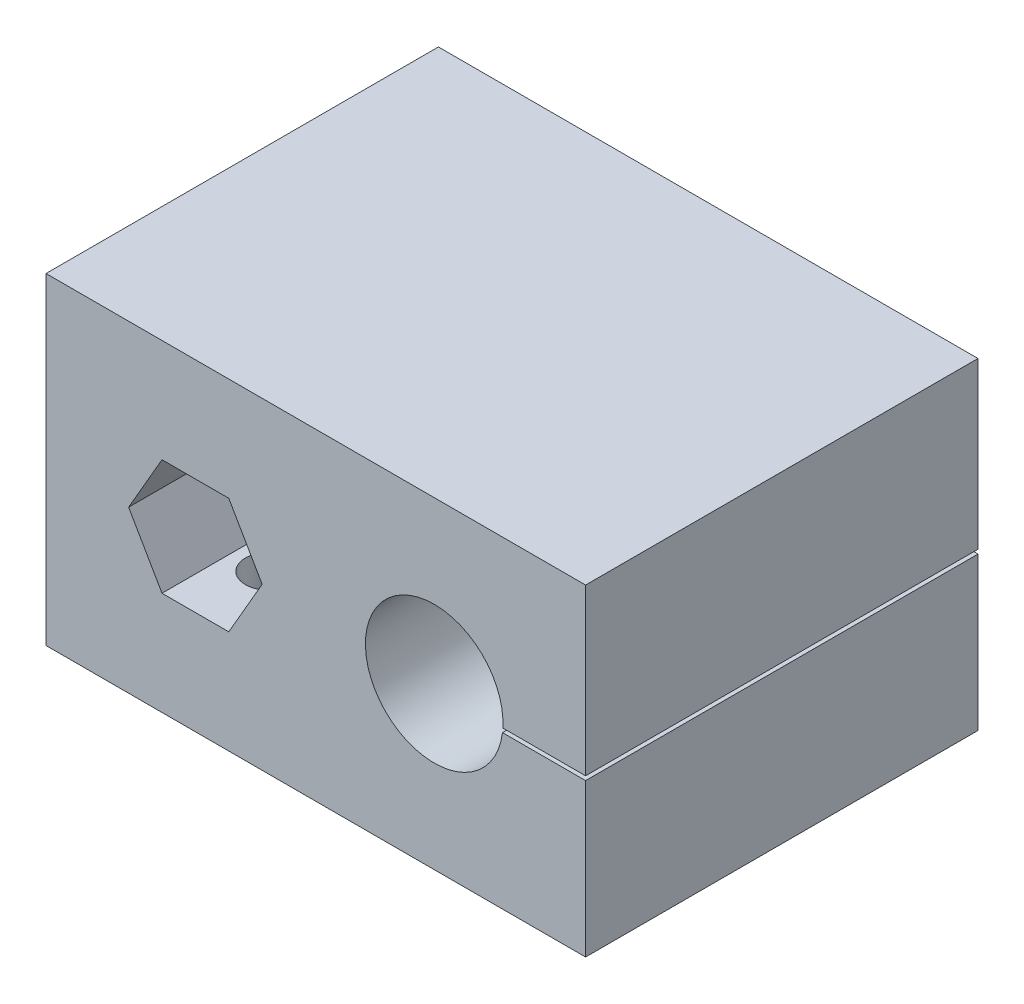
ISO-10303-21;
HEADER;
FILE_DESCRIPTION(('STEP AP214'),'2;1');
FILE_NAME('part.step','',(''),(''),'','','');
FILE_SCHEMA(('AUTOMOTIVE_DESIGN { 1 0 10303 214 1 1 1 1 }'));
ENDSEC;
DATA;
#1=APPLICATION_CONTEXT('core data for automotive mechanical design processes');
#2=APPLICATION_PROTOCOL_DEFINITION('international standard','automotive_design',2000,#1);
#3=PRODUCT_CONTEXT('',#1,'mechanical');
#4=PRODUCT('Part','Part','',(#3));
#5=PRODUCT_RELATED_PRODUCT_CATEGORY('part','',(#4));
#6=PRODUCT_DEFINITION_FORMATION('','',#4);
#7=PRODUCT_DEFINITION_CONTEXT('part definition',#1,'design');
#8=PRODUCT_DEFINITION('design','',#6,#7);
#9=PRODUCT_DEFINITION_SHAPE('','',#8);
#10=(LENGTH_UNIT() NAMED_UNIT(*) SI_UNIT(.MILLI.,.METRE.));
#11=(NAMED_UNIT(*) PLANE_ANGLE_UNIT() SI_UNIT($,.RADIAN.));
#12=(NAMED_UNIT(*) SI_UNIT($,.STERADIAN.) SOLID_ANGLE_UNIT());
#13=UNCERTAINTY_MEASURE_WITH_UNIT(LENGTH_MEASURE(1.E-05),#10,'distance_accuracy_value','');
#14=(GEOMETRIC_REPRESENTATION_CONTEXT(3) GLOBAL_UNCERTAINTY_ASSIGNED_CONTEXT((#13)) GLOBAL_UNIT_ASSIGNED_CONTEXT((#10,
#11,#12)) REPRESENTATION_CONTEXT('',''));
#15=CARTESIAN_POINT('',(0.,0.,0.));
#16=DIRECTION('',(0.,0.,1.));
#17=DIRECTION('',(1.,0.,0.));
#18=AXIS2_PLACEMENT_3D('',#15,#16,#17);
#19=CARTESIAN_POINT('',(16.7132,9.906254,12.065));
#20=DIRECTION('',(-1.,0.,0.));
#21=DIRECTION('',(0.,-1.,0.));
#22=AXIS2_PLACEMENT_3D('',#19,#20,#21);
#23=PLANE('',#22);
#24=DIRECTION('',(0.,1.,0.));
#25=VECTOR('',#24,1.);
#26=CARTESIAN_POINT('',(16.7132,9.906254,-12.065));
#27=LINE('',#26,#25);
#28=CARTESIAN_POINT('',(16.7132,-9.905746,-12.065));
#29=VERTEX_POINT('',#28);
#30=CARTESIAN_POINT('',(16.7132,-0.508,-12.065));
#31=VERTEX_POINT('',#30);
#32=EDGE_CURVE('E173',#29,#31,#27,.T.);
#33=ORIENTED_EDGE('',*,*,#32,.T.);
#34=DIRECTION('',(0.,0.,1.));
#35=VECTOR('',#34,1.);
#36=CARTESIAN_POINT('',(16.7132,-0.507999999999998,12.065));
#37=LINE('',#36,#35);
#38=CARTESIAN_POINT('',(16.7132,-0.508,12.065));
#39=VERTEX_POINT('',#38);
#40=EDGE_CURVE('E138',#31,#39,#37,.T.);
#41=ORIENTED_EDGE('',*,*,#40,.T.);
#42=DIRECTION('',(0.,1.,0.));
#43=VECTOR('',#42,1.);
#44=CARTESIAN_POINT('',(16.7132,9.906254,12.065));
#45=LINE('',#44,#43);
#46=CARTESIAN_POINT('',(16.7132,-9.905746,12.065));
#47=VERTEX_POINT('',#46);
#48=EDGE_CURVE('E155',#47,#39,#45,.T.);
#49=ORIENTED_EDGE('',*,*,#48,.F.);
#50=DIRECTION('',(0.,0.,-1.));
#51=VECTOR('',#50,1.);
#52=CARTESIAN_POINT('',(16.7132,-9.905746,12.065));
#53=LINE('',#52,#51);
#54=EDGE_CURVE('E181',#47,#29,#53,.T.);
#55=ORIENTED_EDGE('',*,*,#54,.T.);
#56=EDGE_LOOP('',(#33,#41,#49,#55));
#57=FACE_BOUND('',#56,.T.);
#58=ADVANCED_FACE('F33',(#57),#23,.F.);
#59=CARTESIAN_POINT('',(0.,0.,12.065));
#60=DIRECTION('',(0.,0.,1.));
#61=DIRECTION('',(1.,0.,0.));
#62=AXIS2_PLACEMENT_3D('',#59,#60,#61);
#63=PLANE('',#62);
#64=DIRECTION('',(1.,0.,0.));
#65=VECTOR('',#64,1.);
#66=CARTESIAN_POINT('',(7.51896494974591,-0.508,12.065));
#67=LINE('',#66,#65);
#68=CARTESIAN_POINT('',(11.6025478895759,-0.508,12.065));
#69=VERTEX_POINT('',#68);
#70=EDGE_CURVE('E149',#69,#39,#67,.T.);
#71=ORIENTED_EDGE('',*,*,#70,.F.);
#72=CARTESIAN_POINT('',(7.4041,0.000254,12.065));
#73=DIRECTION('',(0.,0.,1.));
#74=DIRECTION('',(1.,0.,0.));
#75=AXIS2_PLACEMENT_3D('',#72,#73,#74);
#76=CIRCLE('',#75,4.2291);
#77=CARTESIAN_POINT('',(11.6255501908093,-0.254,12.065));
#78=VERTEX_POINT('',#77);
#79=EDGE_CURVE('E148',#78,#69,#76,.T.);
#80=ORIENTED_EDGE('',*,*,#79,.F.);
#81=DIRECTION('',(-1.,0.,0.));
#82=VECTOR('',#81,1.);
#83=CARTESIAN_POINT('',(7.51896494974591,-0.254,12.065));
#84=LINE('',#83,#82);
#85=CARTESIAN_POINT('',(16.7132,-0.254,12.065));
#86=VERTEX_POINT('',#85);
#87=EDGE_CURVE('E55',#86,#78,#84,.T.);
#88=ORIENTED_EDGE('',*,*,#87,.F.);
#89=CARTESIAN_POINT('',(16.7132,9.906254,12.065));
#90=VERTEX_POINT('',#89);
#91=EDGE_CURVE('E145',#86,#90,#45,.T.);
#92=ORIENTED_EDGE('',*,*,#91,.T.);
#93=DIRECTION('',(-1.,0.,0.));
#94=VECTOR('',#93,1.);
#95=CARTESIAN_POINT('',(-16.4672302289532,9.906254,12.065));
#96=LINE('',#95,#94);
#97=CARTESIAN_POINT('',(-16.4672302289532,9.906254,12.065));
#98=VERTEX_POINT('',#97);
#99=EDGE_CURVE('E159',#90,#98,#96,.T.);
#100=ORIENTED_EDGE('',*,*,#99,.T.);
#101=DIRECTION('',(0.,-1.,0.));
#102=VECTOR('',#101,1.);
#103=CARTESIAN_POINT('',(-16.4672302289532,9.906254,12.065));
#104=LINE('',#103,#102);
#105=CARTESIAN_POINT('',(-16.4672302289532,-9.905746,12.065));
#106=VERTEX_POINT('',#105);
#107=EDGE_CURVE('E160',#98,#106,#104,.T.);
#108=ORIENTED_EDGE('',*,*,#107,.T.);
#109=DIRECTION('',(1.,0.,0.));
#110=VECTOR('',#109,1.);
#111=CARTESIAN_POINT('',(-16.4672302289532,-9.905746,12.065));
#112=LINE('',#111,#110);
#113=EDGE_CURVE('E156',#106,#47,#112,.T.);
#114=ORIENTED_EDGE('',*,*,#113,.T.);
#115=ORIENTED_EDGE('',*,*,#48,.T.);
#116=EDGE_LOOP('',(#71,#80,#88,#92,#100,#108,#114,#115));
#117=FACE_BOUND('',#116,.T.);
#118=DIRECTION('',(0.5,-0.866025403784439,0.));
#119=VECTOR('',#118,1.);
#120=CARTESIAN_POINT('',(-11.3872302289532,0.000254000000003339,12.065));
#121=LINE('',#120,#119);
#122=CARTESIAN_POINT('',(-11.3872302289532,0.000254000000003339,12.065));
#123=VERTEX_POINT('',#122);
#124=CARTESIAN_POINT('',(-9.33417267171493,-3.555746,12.065));
#125=VERTEX_POINT('',#124);
#126=EDGE_CURVE('E205',#123,#125,#121,.T.);
#127=ORIENTED_EDGE('',*,*,#126,.F.);
#128=DIRECTION('',(-0.5,-0.866025403784439,0.));
#129=VECTOR('',#128,1.);
#130=CARTESIAN_POINT('',(-9.33417267171493,3.556254,12.065));
#131=LINE('',#130,#129);
#132=CARTESIAN_POINT('',(-9.33417267171493,3.556254,12.065));
#133=VERTEX_POINT('',#132);
#134=EDGE_CURVE('E203',#133,#123,#131,.T.);
#135=ORIENTED_EDGE('',*,*,#134,.F.);
#136=DIRECTION('',(-1.,0.,0.));
#137=VECTOR('',#136,1.);
#138=CARTESIAN_POINT('',(-5.22805755723831,3.556254,12.065));
#139=LINE('',#138,#137);
#140=CARTESIAN_POINT('',(-5.22805755723831,3.556254,12.065));
#141=VERTEX_POINT('',#140);
#142=EDGE_CURVE('E215',#141,#133,#139,.T.);
#143=ORIENTED_EDGE('',*,*,#142,.F.);
#144=DIRECTION('',(-0.5,0.866025403784439,0.));
#145=VECTOR('',#144,1.);
#146=CARTESIAN_POINT('',(-3.175,0.000254000000000001,12.065));
#147=LINE('',#146,#145);
#148=CARTESIAN_POINT('',(-3.175,0.000254000000000001,12.065));
#149=VERTEX_POINT('',#148);
#150=EDGE_CURVE('E212',#149,#141,#147,.T.);
#151=ORIENTED_EDGE('',*,*,#150,.F.);
#152=DIRECTION('',(0.5,0.866025403784439,0.));
#153=VECTOR('',#152,1.);
#154=CARTESIAN_POINT('',(-5.22805755723831,-3.555746,12.065));
#155=LINE('',#154,#153);
#156=CARTESIAN_POINT('',(-5.22805755723831,-3.555746,12.065));
#157=VERTEX_POINT('',#156);
#158=EDGE_CURVE('E210',#157,#149,#155,.T.);
#159=ORIENTED_EDGE('',*,*,#158,.F.);
#160=DIRECTION('',(1.,0.,0.));
#161=VECTOR('',#160,1.);
#162=CARTESIAN_POINT('',(-9.33417267171493,-3.555746,12.065));
#163=LINE('',#162,#161);
#164=EDGE_CURVE('E208',#125,#157,#163,.T.);
#165=ORIENTED_EDGE('',*,*,#164,.F.);
#166=EDGE_LOOP('',(#127,#135,#143,#151,#159,#165));
#167=FACE_BOUND('',#166,.T.);
#168=ADVANCED_FACE('F143',(#117,#167),#63,.T.);
#169=CARTESIAN_POINT('',(0.,0.,-12.065));
#170=DIRECTION('',(0.,0.,1.));
#171=DIRECTION('',(1.,0.,0.));
#172=AXIS2_PLACEMENT_3D('',#169,#170,#171);
#173=PLANE('',#172);
#174=DIRECTION('',(-0.5,-0.866025403784439,0.));
#175=VECTOR('',#174,1.);
#176=CARTESIAN_POINT('',(-9.33417267171493,3.556254,-12.065));
#177=LINE('',#176,#175);
#178=CARTESIAN_POINT('',(-9.33417267171493,3.556254,-12.065));
#179=VERTEX_POINT('',#178);
#180=CARTESIAN_POINT('',(-11.3872302289532,0.000254000000003339,-12.065));
#181=VERTEX_POINT('',#180);
#182=EDGE_CURVE('E197',#179,#181,#177,.T.);
#183=ORIENTED_EDGE('',*,*,#182,.T.);
#184=DIRECTION('',(0.5,-0.866025403784439,0.));
#185=VECTOR('',#184,1.);
#186=CARTESIAN_POINT('',(-11.3872302289532,0.000254000000003339,-12.065));
#187=LINE('',#186,#185);
#188=CARTESIAN_POINT('',(-9.33417267171493,-3.555746,-12.065));
#189=VERTEX_POINT('',#188);
#190=EDGE_CURVE('E220',#181,#189,#187,.T.);
#191=ORIENTED_EDGE('',*,*,#190,.T.);
#192=DIRECTION('',(1.,0.,0.));
#193=VECTOR('',#192,1.);
#194=CARTESIAN_POINT('',(-9.33417267171493,-3.555746,-12.065));
#195=LINE('',#194,#193);
#196=CARTESIAN_POINT('',(-5.22805755723831,-3.555746,-12.065));
#197=VERTEX_POINT('',#196);
#198=EDGE_CURVE('E223',#189,#197,#195,.T.);
#199=ORIENTED_EDGE('',*,*,#198,.T.);
#200=DIRECTION('',(0.5,0.866025403784439,0.));
#201=VECTOR('',#200,1.);
#202=CARTESIAN_POINT('',(-5.22805755723831,-3.555746,-12.065));
#203=LINE('',#202,#201);
#204=CARTESIAN_POINT('',(-3.175,0.000254000000000001,-12.065));
#205=VERTEX_POINT('',#204);
#206=EDGE_CURVE('E226',#197,#205,#203,.T.);
#207=ORIENTED_EDGE('',*,*,#206,.T.);
#208=DIRECTION('',(-0.5,0.866025403784439,0.));
#209=VECTOR('',#208,1.);
#210=CARTESIAN_POINT('',(-3.175,0.000254000000000001,-12.065));
#211=LINE('',#210,#209);
#212=CARTESIAN_POINT('',(-5.22805755723831,3.556254,-12.065));
#213=VERTEX_POINT('',#212);
#214=EDGE_CURVE('E229',#205,#213,#211,.T.);
#215=ORIENTED_EDGE('',*,*,#214,.T.);
#216=DIRECTION('',(-1.,0.,0.));
#217=VECTOR('',#216,1.);
#218=CARTESIAN_POINT('',(-5.22805755723831,3.556254,-12.065));
#219=LINE('',#218,#217);
#220=EDGE_CURVE('E206',#213,#179,#219,.T.);
#221=ORIENTED_EDGE('',*,*,#220,.T.);
#222=EDGE_LOOP('',(#183,#191,#199,#207,#215,#221));
#223=FACE_BOUND('',#222,.T.);
#224=CARTESIAN_POINT('',(7.4041,0.000254,-12.065));
#225=DIRECTION('',(0.,0.,1.));
#226=DIRECTION('',(1.,0.,0.));
#227=AXIS2_PLACEMENT_3D('',#224,#225,#226);
#228=CIRCLE('',#227,4.2291);
#229=CARTESIAN_POINT('',(11.6255501908093,-0.254,-12.065));
#230=VERTEX_POINT('',#229);
#231=CARTESIAN_POINT('',(11.6025478895759,-0.508,-12.065));
#232=VERTEX_POINT('',#231);
#233=EDGE_CURVE('E191',#230,#232,#228,.T.);
#234=ORIENTED_EDGE('',*,*,#233,.T.);
#235=DIRECTION('',(1.,0.,0.));
#236=VECTOR('',#235,1.);
#237=CARTESIAN_POINT('',(7.51896494974591,-0.508,-12.065));
#238=LINE('',#237,#236);
#239=EDGE_CURVE('E47',#232,#31,#238,.T.);
#240=ORIENTED_EDGE('',*,*,#239,.T.);
#241=ORIENTED_EDGE('',*,*,#32,.F.);
#242=DIRECTION('',(1.,0.,0.));
#243=VECTOR('',#242,1.);
#244=CARTESIAN_POINT('',(-16.4672302289532,-9.905746,-12.065));
#245=LINE('',#244,#243);
#246=CARTESIAN_POINT('',(-16.4672302289532,-9.905746,-12.065));
#247=VERTEX_POINT('',#246);
#248=EDGE_CURVE('E169',#247,#29,#245,.T.);
#249=ORIENTED_EDGE('',*,*,#248,.F.);
#250=DIRECTION('',(0.,-1.,0.));
#251=VECTOR('',#250,1.);
#252=CARTESIAN_POINT('',(-16.4672302289532,9.906254,-12.065));
#253=LINE('',#252,#251);
#254=CARTESIAN_POINT('',(-16.4672302289532,9.906254,-12.065));
#255=VERTEX_POINT('',#254);
#256=EDGE_CURVE('E166',#255,#247,#253,.T.);
#257=ORIENTED_EDGE('',*,*,#256,.F.);
#258=DIRECTION('',(-1.,0.,0.));
#259=VECTOR('',#258,1.);
#260=CARTESIAN_POINT('',(-16.4672302289532,9.906254,-12.065));
#261=LINE('',#260,#259);
#262=CARTESIAN_POINT('',(16.7132,9.906254,-12.065));
#263=VERTEX_POINT('',#262);
#264=EDGE_CURVE('E176',#263,#255,#261,.T.);
#265=ORIENTED_EDGE('',*,*,#264,.F.);
#266=CARTESIAN_POINT('',(16.7132,-0.254,-12.065));
#267=VERTEX_POINT('',#266);
#268=EDGE_CURVE('E172',#267,#263,#27,.T.);
#269=ORIENTED_EDGE('',*,*,#268,.F.);
#270=DIRECTION('',(-1.,0.,0.));
#271=VECTOR('',#270,1.);
#272=CARTESIAN_POINT('',(7.51896494974591,-0.254,-12.065));
#273=LINE('',#272,#271);
#274=EDGE_CURVE('E134',#267,#230,#273,.T.);
#275=ORIENTED_EDGE('',*,*,#274,.T.);
#276=EDGE_LOOP('',(#234,#240,#241,#249,#257,#265,#269,#275));
#277=FACE_BOUND('',#276,.T.);
#278=ADVANCED_FACE('F190',(#223,#277),#173,.F.);
#279=CARTESIAN_POINT('',(-16.4672302289532,9.906254,12.065));
#280=DIRECTION('',(1.,0.,0.));
#281=DIRECTION('',(0.,1.,0.));
#282=AXIS2_PLACEMENT_3D('',#279,#280,#281);
#283=PLANE('',#282);
#284=ORIENTED_EDGE('',*,*,#256,.T.);
#285=DIRECTION('',(0.,0.,-1.));
#286=VECTOR('',#285,1.);
#287=CARTESIAN_POINT('',(-16.4672302289532,-9.905746,12.065));
#288=LINE('',#287,#286);
#289=EDGE_CURVE('E184',#106,#247,#288,.T.);
#290=ORIENTED_EDGE('',*,*,#289,.F.);
#291=ORIENTED_EDGE('',*,*,#107,.F.);
#292=DIRECTION('',(0.,0.,-1.));
#293=VECTOR('',#292,1.);
#294=CARTESIAN_POINT('',(-16.4672302289532,9.906254,12.065));
#295=LINE('',#294,#293);
#296=EDGE_CURVE('E165',#98,#255,#295,.T.);
#297=ORIENTED_EDGE('',*,*,#296,.T.);
#298=EDGE_LOOP('',(#284,#290,#291,#297));
#299=FACE_BOUND('',#298,.T.);
#300=ADVANCED_FACE('F35',(#299),#283,.F.);
#301=CARTESIAN_POINT('',(-16.4672302289532,-9.905746,12.065));
#302=DIRECTION('',(0.,1.,0.));
#303=DIRECTION('',(0.,0.,1.));
#304=AXIS2_PLACEMENT_3D('',#301,#302,#303);
#305=PLANE('',#304);
#306=CARTESIAN_POINT('',(-7.22812578387597,-9.905746,7.62));
#307=DIRECTION('',(0.,1.,0.));
#308=DIRECTION('',(0.,0.,1.));
#309=AXIS2_PLACEMENT_3D('',#306,#307,#308);
#310=CIRCLE('',#309,1.4224);
#311=CARTESIAN_POINT('',(-7.22812578387597,-9.905746,9.0424));
#312=VERTEX_POINT('',#311);
#313=EDGE_CURVE('E262',#312,#312,#310,.F.);
#314=ORIENTED_EDGE('',*,*,#313,.F.);
#315=EDGE_LOOP('',(#314));
#316=FACE_BOUND('',#315,.T.);
#317=CARTESIAN_POINT('',(-7.22812578387597,-9.905746,-7.62));
#318=DIRECTION('',(0.,1.,0.));
#319=DIRECTION('',(0.,0.,1.));
#320=AXIS2_PLACEMENT_3D('',#317,#318,#319);
#321=CIRCLE('',#320,1.4224);
#322=CARTESIAN_POINT('',(-7.22812578387597,-9.905746,-6.1976));
#323=VERTEX_POINT('',#322);
#324=EDGE_CURVE('E195',#323,#323,#321,.F.);
#325=ORIENTED_EDGE('',*,*,#324,.F.);
#326=EDGE_LOOP('',(#325));
#327=FACE_BOUND('',#326,.T.);
#328=ORIENTED_EDGE('',*,*,#248,.T.);
#329=ORIENTED_EDGE('',*,*,#54,.F.);
#330=ORIENTED_EDGE('',*,*,#113,.F.);
#331=ORIENTED_EDGE('',*,*,#289,.T.);
#332=EDGE_LOOP('',(#328,#329,#330,#331));
#333=FACE_BOUND('',#332,.T.);
#334=ADVANCED_FACE('F253',(#316,#327,#333),#305,.F.);
#335=ORIENTED_EDGE('',*,*,#91,.F.);
#336=DIRECTION('',(0.,0.,-1.));
#337=VECTOR('',#336,1.);
#338=CARTESIAN_POINT('',(16.7132,-0.253999999999999,12.065));
#339=LINE('',#338,#337);
#340=EDGE_CURVE('E131',#86,#267,#339,.T.);
#341=ORIENTED_EDGE('',*,*,#340,.T.);
#342=ORIENTED_EDGE('',*,*,#268,.T.);
#343=DIRECTION('',(0.,0.,-1.));
#344=VECTOR('',#343,1.);
#345=CARTESIAN_POINT('',(16.7132,9.906254,12.065));
#346=LINE('',#345,#344);
#347=EDGE_CURVE('E153',#90,#263,#346,.T.);
#348=ORIENTED_EDGE('',*,*,#347,.F.);
#349=EDGE_LOOP('',(#335,#341,#342,#348));
#350=FACE_BOUND('',#349,.T.);
#351=ADVANCED_FACE('F151',(#350),#23,.F.);
#352=CARTESIAN_POINT('',(-16.4672302289532,9.906254,12.065));
#353=DIRECTION('',(0.,-1.,0.));
#354=DIRECTION('',(0.,0.,-1.));
#355=AXIS2_PLACEMENT_3D('',#352,#353,#354);
#356=PLANE('',#355);
#357=ORIENTED_EDGE('',*,*,#264,.T.);
#358=ORIENTED_EDGE('',*,*,#296,.F.);
#359=ORIENTED_EDGE('',*,*,#99,.F.);
#360=ORIENTED_EDGE('',*,*,#347,.T.);
#361=EDGE_LOOP('',(#357,#358,#359,#360));
#362=FACE_BOUND('',#361,.T.);
#363=ADVANCED_FACE('F287',(#362),#356,.F.);
#364=CARTESIAN_POINT('',(-9.33417267171493,3.556254,12.065));
#365=DIRECTION('',(0.866025403784438,-0.5,0.));
#366=DIRECTION('',(0.5,0.866025403784439,0.));
#367=AXIS2_PLACEMENT_3D('',#364,#365,#366);
#368=PLANE('',#367);
#369=ORIENTED_EDGE('',*,*,#182,.F.);
#370=DIRECTION('',(0.,0.,-1.));
#371=VECTOR('',#370,1.);
#372=CARTESIAN_POINT('',(-9.33417267171493,3.556254,12.065));
#373=LINE('',#372,#371);
#374=EDGE_CURVE('E217',#133,#179,#373,.T.);
#375=ORIENTED_EDGE('',*,*,#374,.F.);
#376=ORIENTED_EDGE('',*,*,#134,.T.);
#377=DIRECTION('',(0.,0.,-1.));
#378=VECTOR('',#377,1.);
#379=CARTESIAN_POINT('',(-11.3872302289532,0.000254000000003339,12.065));
#380=LINE('',#379,#378);
#381=EDGE_CURVE('E170',#123,#181,#380,.T.);
#382=ORIENTED_EDGE('',*,*,#381,.T.);
#383=EDGE_LOOP('',(#369,#375,#376,#382));
#384=FACE_BOUND('',#383,.T.);
#385=ADVANCED_FACE('F298',(#384),#368,.T.);
#386=CARTESIAN_POINT('',(-11.3872302289532,0.000254000000003339,12.065));
#387=DIRECTION('',(0.866025403784439,0.5,0.));
#388=DIRECTION('',(-0.5,0.866025403784439,0.));
#389=AXIS2_PLACEMENT_3D('',#386,#387,#388);
#390=PLANE('',#389);
#391=ORIENTED_EDGE('',*,*,#190,.F.);
#392=ORIENTED_EDGE('',*,*,#381,.F.);
#393=ORIENTED_EDGE('',*,*,#126,.T.);
#394=DIRECTION('',(0.,0.,-1.));
#395=VECTOR('',#394,1.);
#396=CARTESIAN_POINT('',(-9.33417267171493,-3.555746,12.065));
#397=LINE('',#396,#395);
#398=EDGE_CURVE('E242',#125,#189,#397,.T.);
#399=ORIENTED_EDGE('',*,*,#398,.T.);
#400=EDGE_LOOP('',(#391,#392,#393,#399));
#401=FACE_BOUND('',#400,.T.);
#402=ADVANCED_FACE('F305',(#401),#390,.T.);
#403=CARTESIAN_POINT('',(-9.33417267171493,-3.555746,12.065));
#404=DIRECTION('',(0.,1.,0.));
#405=DIRECTION('',(0.,0.,1.));
#406=AXIS2_PLACEMENT_3D('',#403,#404,#405);
#407=PLANE('',#406);
#408=CARTESIAN_POINT('',(-7.22812578387597,-3.555746,7.62));
#409=DIRECTION('',(0.,1.,0.));
#410=DIRECTION('',(0.,0.,1.));
#411=AXIS2_PLACEMENT_3D('',#408,#409,#410);
#412=CIRCLE('',#411,1.4224);
#413=CARTESIAN_POINT('',(-7.22812578387597,-3.555746,9.0424));
#414=VERTEX_POINT('',#413);
#415=EDGE_CURVE('E265',#414,#414,#412,.F.);
#416=ORIENTED_EDGE('',*,*,#415,.T.);
#417=EDGE_LOOP('',(#416));
#418=FACE_BOUND('',#417,.T.);
#419=CARTESIAN_POINT('',(-7.22812578387597,-3.555746,-7.62));
#420=DIRECTION('',(0.,1.,0.));
#421=DIRECTION('',(0.,0.,1.));
#422=AXIS2_PLACEMENT_3D('',#419,#420,#421);
#423=CIRCLE('',#422,1.4224);
#424=CARTESIAN_POINT('',(-7.22812578387597,-3.555746,-6.1976));
#425=VERTEX_POINT('',#424);
#426=EDGE_CURVE('E200',#425,#425,#423,.F.);
#427=ORIENTED_EDGE('',*,*,#426,.T.);
#428=EDGE_LOOP('',(#427));
#429=FACE_BOUND('',#428,.T.);
#430=ORIENTED_EDGE('',*,*,#198,.F.);
#431=ORIENTED_EDGE('',*,*,#398,.F.);
#432=ORIENTED_EDGE('',*,*,#164,.T.);
#433=DIRECTION('',(0.,0.,-1.));
#434=VECTOR('',#433,1.);
#435=CARTESIAN_POINT('',(-5.22805755723831,-3.555746,12.065));
#436=LINE('',#435,#434);
#437=EDGE_CURVE('E240',#157,#197,#436,.T.);
#438=ORIENTED_EDGE('',*,*,#437,.T.);
#439=EDGE_LOOP('',(#430,#431,#432,#438));
#440=FACE_BOUND('',#439,.T.);
#441=ADVANCED_FACE('F271',(#418,#429,#440),#407,.T.);
#442=CARTESIAN_POINT('',(-5.22805755723831,-3.555746,12.065));
#443=DIRECTION('',(-0.866025403784438,0.5,0.));
#444=DIRECTION('',(-0.5,-0.866025403784439,0.));
#445=AXIS2_PLACEMENT_3D('',#442,#443,#444);
#446=PLANE('',#445);
#447=ORIENTED_EDGE('',*,*,#206,.F.);
#448=ORIENTED_EDGE('',*,*,#437,.F.);
#449=ORIENTED_EDGE('',*,*,#158,.T.);
#450=DIRECTION('',(0.,0.,-1.));
#451=VECTOR('',#450,1.);
#452=CARTESIAN_POINT('',(-3.175,0.000254000000000001,12.065));
#453=LINE('',#452,#451);
#454=EDGE_CURVE('E238',#149,#205,#453,.T.);
#455=ORIENTED_EDGE('',*,*,#454,.T.);
#456=EDGE_LOOP('',(#447,#448,#449,#455));
#457=FACE_BOUND('',#456,.T.);
#458=ADVANCED_FACE('F312',(#457),#446,.T.);
#459=CARTESIAN_POINT('',(-3.175,0.000254000000000001,12.065));
#460=DIRECTION('',(-0.866025403784439,-0.5,0.));
#461=DIRECTION('',(0.5,-0.866025403784439,0.));
#462=AXIS2_PLACEMENT_3D('',#459,#460,#461);
#463=PLANE('',#462);
#464=ORIENTED_EDGE('',*,*,#214,.F.);
#465=ORIENTED_EDGE('',*,*,#454,.F.);
#466=ORIENTED_EDGE('',*,*,#150,.T.);
#467=DIRECTION('',(0.,0.,-1.));
#468=VECTOR('',#467,1.);
#469=CARTESIAN_POINT('',(-5.22805755723831,3.556254,12.065));
#470=LINE('',#469,#468);
#471=EDGE_CURVE('E236',#141,#213,#470,.T.);
#472=ORIENTED_EDGE('',*,*,#471,.T.);
#473=EDGE_LOOP('',(#464,#465,#466,#472));
#474=FACE_BOUND('',#473,.T.);
#475=ADVANCED_FACE('F316',(#474),#463,.T.);
#476=CARTESIAN_POINT('',(-5.22805755723831,3.556254,12.065));
#477=DIRECTION('',(0.,-1.,0.));
#478=DIRECTION('',(1.,0.,0.));
#479=AXIS2_PLACEMENT_3D('',#476,#477,#478);
#480=PLANE('',#479);
#481=ORIENTED_EDGE('',*,*,#220,.F.);
#482=ORIENTED_EDGE('',*,*,#471,.F.);
#483=ORIENTED_EDGE('',*,*,#142,.T.);
#484=ORIENTED_EDGE('',*,*,#374,.T.);
#485=EDGE_LOOP('',(#481,#482,#483,#484));
#486=FACE_BOUND('',#485,.T.);
#487=ADVANCED_FACE('F320',(#486),#480,.T.);
#488=CARTESIAN_POINT('',(7.4041,0.000254,12.065));
#489=DIRECTION('',(0.,0.,-1.));
#490=DIRECTION('',(-1.,0.,0.));
#491=AXIS2_PLACEMENT_3D('',#488,#489,#490);
#492=CYLINDRICAL_SURFACE('',#491,4.2291);
#493=DIRECTION('',(0.,0.,-1.));
#494=VECTOR('',#493,1.);
#495=CARTESIAN_POINT('',(11.6025478895759,-0.508,12.065));
#496=LINE('',#495,#494);
#497=EDGE_CURVE('E11',#232,#69,#496,.F.);
#498=ORIENTED_EDGE('',*,*,#497,.F.);
#499=ORIENTED_EDGE('',*,*,#233,.F.);
#500=DIRECTION('',(0.,0.,-1.));
#501=VECTOR('',#500,1.);
#502=CARTESIAN_POINT('',(11.6255501908093,-0.254,12.065));
#503=LINE('',#502,#501);
#504=EDGE_CURVE('E41',#78,#230,#503,.T.);
#505=ORIENTED_EDGE('',*,*,#504,.F.);
#506=ORIENTED_EDGE('',*,*,#79,.T.);
#507=EDGE_LOOP('',(#498,#499,#505,#506));
#508=FACE_BOUND('',#507,.T.);
#509=ADVANCED_FACE('F194',(#508),#492,.F.);
#510=CARTESIAN_POINT('',(-7.22812578387597,-9.906746,-7.62));
#511=DIRECTION('',(0.,1.,0.));
#512=DIRECTION('',(0.,0.,1.));
#513=AXIS2_PLACEMENT_3D('',#510,#511,#512);
#514=CYLINDRICAL_SURFACE('',#513,1.4224);
#515=CARTESIAN_POINT('',(-7.22812578387597,-3.555746,-6.1976));
#516=CARTESIAN_POINT('',(-7.22812578387597,-3.62189183333333,-6.1976));
#517=CARTESIAN_POINT('',(-7.22812578387597,-3.68803766666667,-6.1976));
#518=CARTESIAN_POINT('',(-7.22812578387597,-3.82032933333333,-6.1976));
#519=CARTESIAN_POINT('',(-7.22812578387597,-3.88647516666667,-6.1976));
#520=CARTESIAN_POINT('',(-7.22812578387597,-4.01876683333333,-6.1976));
#521=CARTESIAN_POINT('',(-7.22812578387597,-4.08491266666667,-6.1976));
#522=CARTESIAN_POINT('',(-7.22812578387597,-4.21720433333333,-6.1976));
#523=CARTESIAN_POINT('',(-7.22812578387597,-4.28335016666667,-6.1976));
#524=CARTESIAN_POINT('',(-7.22812578387597,-4.41564183333333,-6.1976));
#525=CARTESIAN_POINT('',(-7.22812578387597,-4.48178766666667,-6.1976));
#526=CARTESIAN_POINT('',(-7.22812578387597,-4.61407933333333,-6.1976));
#527=CARTESIAN_POINT('',(-7.22812578387597,-4.68022516666667,-6.1976));
#528=CARTESIAN_POINT('',(-7.22812578387597,-4.81251683333333,-6.1976));
#529=CARTESIAN_POINT('',(-7.22812578387597,-4.87866266666667,-6.1976));
#530=CARTESIAN_POINT('',(-7.22812578387597,-5.01095433333333,-6.1976));
#531=CARTESIAN_POINT('',(-7.22812578387597,-5.07710016666667,-6.1976));
#532=CARTESIAN_POINT('',(-7.22812578387597,-5.20939183333333,-6.1976));
#533=CARTESIAN_POINT('',(-7.22812578387597,-5.27553766666667,-6.1976));
#534=CARTESIAN_POINT('',(-7.22812578387597,-5.40782933333333,-6.1976));
#535=CARTESIAN_POINT('',(-7.22812578387597,-5.47397516666667,-6.1976));
#536=CARTESIAN_POINT('',(-7.22812578387597,-5.60626683333333,-6.1976));
#537=CARTESIAN_POINT('',(-7.22812578387597,-5.67241266666667,-6.1976));
#538=CARTESIAN_POINT('',(-7.22812578387597,-5.80470433333333,-6.1976));
#539=CARTESIAN_POINT('',(-7.22812578387597,-5.87085016666667,-6.1976));
#540=CARTESIAN_POINT('',(-7.22812578387597,-6.00314183333333,-6.1976));
#541=CARTESIAN_POINT('',(-7.22812578387597,-6.06928766666667,-6.1976));
#542=CARTESIAN_POINT('',(-7.22812578387597,-6.20157933333333,-6.1976));
#543=CARTESIAN_POINT('',(-7.22812578387597,-6.26772516666667,-6.1976));
#544=CARTESIAN_POINT('',(-7.22812578387597,-6.40001683333333,-6.1976));
#545=CARTESIAN_POINT('',(-7.22812578387597,-6.46616266666667,-6.1976));
#546=CARTESIAN_POINT('',(-7.22812578387597,-6.59845433333333,-6.1976));
#547=CARTESIAN_POINT('',(-7.22812578387597,-6.66460016666667,-6.1976));
#548=CARTESIAN_POINT('',(-7.22812578387597,-6.79689183333333,-6.1976));
#549=CARTESIAN_POINT('',(-7.22812578387597,-6.86303766666667,-6.1976));
#550=CARTESIAN_POINT('',(-7.22812578387597,-6.99532933333333,-6.1976));
#551=CARTESIAN_POINT('',(-7.22812578387597,-7.06147516666667,-6.1976));
#552=CARTESIAN_POINT('',(-7.22812578387597,-7.19376683333333,-6.1976));
#553=CARTESIAN_POINT('',(-7.22812578387597,-7.25991266666667,-6.1976));
#554=CARTESIAN_POINT('',(-7.22812578387597,-7.39220433333333,-6.1976));
#555=CARTESIAN_POINT('',(-7.22812578387597,-7.45835016666667,-6.1976));
#556=CARTESIAN_POINT('',(-7.22812578387597,-7.59064183333333,-6.1976));
#557=CARTESIAN_POINT('',(-7.22812578387597,-7.65678766666667,-6.1976));
#558=CARTESIAN_POINT('',(-7.22812578387597,-7.78907933333333,-6.1976));
#559=CARTESIAN_POINT('',(-7.22812578387597,-7.85522516666667,-6.1976));
#560=CARTESIAN_POINT('',(-7.22812578387597,-7.98751683333333,-6.1976));
#561=CARTESIAN_POINT('',(-7.22812578387597,-8.05366266666667,-6.1976));
#562=CARTESIAN_POINT('',(-7.22812578387597,-8.18595433333333,-6.1976));
#563=CARTESIAN_POINT('',(-7.22812578387597,-8.25210016666667,-6.1976));
#564=CARTESIAN_POINT('',(-7.22812578387597,-8.38439183333333,-6.1976));
#565=CARTESIAN_POINT('',(-7.22812578387597,-8.45053766666667,-6.1976));
#566=CARTESIAN_POINT('',(-7.22812578387597,-8.58282933333333,-6.1976));
#567=CARTESIAN_POINT('',(-7.22812578387597,-8.64897516666667,-6.1976));
#568=CARTESIAN_POINT('',(-7.22812578387597,-8.78126683333333,-6.1976));
#569=CARTESIAN_POINT('',(-7.22812578387597,-8.84741266666667,-6.1976));
#570=CARTESIAN_POINT('',(-7.22812578387597,-8.97970433333333,-6.1976));
#571=CARTESIAN_POINT('',(-7.22812578387597,-9.04585016666667,-6.1976));
#572=CARTESIAN_POINT('',(-7.22812578387597,-9.17814183333333,-6.1976));
#573=CARTESIAN_POINT('',(-7.22812578387597,-9.24428766666667,-6.1976));
#574=CARTESIAN_POINT('',(-7.22812578387597,-9.37657933333333,-6.1976));
#575=CARTESIAN_POINT('',(-7.22812578387597,-9.44272516666667,-6.1976));
#576=CARTESIAN_POINT('',(-7.22812578387597,-9.57501683333333,-6.1976));
#577=CARTESIAN_POINT('',(-7.22812578387597,-9.64116266666667,-6.1976));
#578=CARTESIAN_POINT('',(-7.22812578387597,-9.77345433333333,-6.1976));
#579=CARTESIAN_POINT('',(-7.22812578387597,-9.83960016666667,-6.1976));
#580=CARTESIAN_POINT('',(-7.22812578387597,-9.905746,-6.1976));
#581=B_SPLINE_CURVE_WITH_KNOTS('',3,(#515,#516,#517,#518,#519,#520,#521,#522,#523,#524,#525,
#526,#527,#528,#529,#530,#531,#532,#533,#534,#535,#536,#537,#538,#539,#540,#541,#542,#543,#544,
#545,#546,#547,#548,#549,#550,#551,#552,#553,#554,#555,#556,#557,#558,#559,#560,#561,#562,#563,
#564,#565,#566,#567,#568,#569,#570,#571,#572,#573,#574,#575,#576,#577,#578,#579,#580),
.UNSPECIFIED.,.F.,.F.,(4,2,2,2,2,2,2,2,2,2,2,2,2,2,2,2,2,2,2,2,2,2,2,2,2,2,2,2,2,2,2,2,4),(0.,
0.1984375,0.396875,0.5953125,0.79375,0.9921875,1.190625,1.3890625,1.5875,1.7859375,1.984375,
2.1828125,2.38125,2.5796875,2.778125,2.9765625,3.175,3.3734375,3.571875,3.7703125,3.96875,
4.1671875,4.365625,4.5640625,4.7625,4.9609375,5.159375,5.3578125,5.55625,5.7546875,5.953125,
6.1515625,6.35),.UNSPECIFIED.);
#582=EDGE_CURVE('BSEAM274',#425,#323,#581,.T.);
#583=ORIENTED_EDGE('',*,*,#426,.F.);
#584=ORIENTED_EDGE('',*,*,#324,.T.);
#585=ORIENTED_EDGE('',*,*,#582,.T.);
#586=ORIENTED_EDGE('',*,*,#582,.F.);
#587=EDGE_LOOP('',(#583,#585,#584,#586));
#588=FACE_BOUND('',#587,.T.);
#589=ADVANCED_FACE('F274',(#588),#514,.F.);
#590=CARTESIAN_POINT('',(-7.22812578387597,-9.906746,7.62));
#591=DIRECTION('',(0.,1.,0.));
#592=DIRECTION('',(0.,0.,1.));
#593=AXIS2_PLACEMENT_3D('',#590,#591,#592);
#594=CYLINDRICAL_SURFACE('',#593,1.4224);
#595=CARTESIAN_POINT('',(-7.22812578387597,-3.555746,9.0424));
#596=CARTESIAN_POINT('',(-7.22812578387597,-3.62189183333333,9.0424));
#597=CARTESIAN_POINT('',(-7.22812578387597,-3.68803766666667,9.0424));
#598=CARTESIAN_POINT('',(-7.22812578387597,-3.82032933333333,9.0424));
#599=CARTESIAN_POINT('',(-7.22812578387597,-3.88647516666667,9.0424));
#600=CARTESIAN_POINT('',(-7.22812578387597,-4.01876683333333,9.0424));
#601=CARTESIAN_POINT('',(-7.22812578387597,-4.08491266666667,9.0424));
#602=CARTESIAN_POINT('',(-7.22812578387597,-4.21720433333333,9.0424));
#603=CARTESIAN_POINT('',(-7.22812578387597,-4.28335016666667,9.0424));
#604=CARTESIAN_POINT('',(-7.22812578387597,-4.41564183333333,9.0424));
#605=CARTESIAN_POINT('',(-7.22812578387597,-4.48178766666667,9.0424));
#606=CARTESIAN_POINT('',(-7.22812578387597,-4.61407933333333,9.0424));
#607=CARTESIAN_POINT('',(-7.22812578387597,-4.68022516666667,9.0424));
#608=CARTESIAN_POINT('',(-7.22812578387597,-4.81251683333333,9.0424));
#609=CARTESIAN_POINT('',(-7.22812578387597,-4.87866266666667,9.0424));
#610=CARTESIAN_POINT('',(-7.22812578387597,-5.01095433333333,9.0424));
#611=CARTESIAN_POINT('',(-7.22812578387597,-5.07710016666667,9.0424));
#612=CARTESIAN_POINT('',(-7.22812578387597,-5.20939183333333,9.0424));
#613=CARTESIAN_POINT('',(-7.22812578387597,-5.27553766666667,9.0424));
#614=CARTESIAN_POINT('',(-7.22812578387597,-5.40782933333333,9.0424));
#615=CARTESIAN_POINT('',(-7.22812578387597,-5.47397516666667,9.0424));
#616=CARTESIAN_POINT('',(-7.22812578387597,-5.60626683333333,9.0424));
#617=CARTESIAN_POINT('',(-7.22812578387597,-5.67241266666667,9.0424));
#618=CARTESIAN_POINT('',(-7.22812578387597,-5.80470433333333,9.0424));
#619=CARTESIAN_POINT('',(-7.22812578387597,-5.87085016666667,9.0424));
#620=CARTESIAN_POINT('',(-7.22812578387597,-6.00314183333333,9.0424));
#621=CARTESIAN_POINT('',(-7.22812578387597,-6.06928766666667,9.0424));
#622=CARTESIAN_POINT('',(-7.22812578387597,-6.20157933333333,9.0424));
#623=CARTESIAN_POINT('',(-7.22812578387597,-6.26772516666667,9.0424));
#624=CARTESIAN_POINT('',(-7.22812578387597,-6.40001683333333,9.0424));
#625=CARTESIAN_POINT('',(-7.22812578387597,-6.46616266666667,9.0424));
#626=CARTESIAN_POINT('',(-7.22812578387597,-6.59845433333333,9.0424));
#627=CARTESIAN_POINT('',(-7.22812578387597,-6.66460016666667,9.0424));
#628=CARTESIAN_POINT('',(-7.22812578387597,-6.79689183333333,9.0424));
#629=CARTESIAN_POINT('',(-7.22812578387597,-6.86303766666667,9.0424));
#630=CARTESIAN_POINT('',(-7.22812578387597,-6.99532933333333,9.0424));
#631=CARTESIAN_POINT('',(-7.22812578387597,-7.06147516666667,9.0424));
#632=CARTESIAN_POINT('',(-7.22812578387597,-7.19376683333333,9.0424));
#633=CARTESIAN_POINT('',(-7.22812578387597,-7.25991266666667,9.0424));
#634=CARTESIAN_POINT('',(-7.22812578387597,-7.39220433333333,9.0424));
#635=CARTESIAN_POINT('',(-7.22812578387597,-7.45835016666667,9.0424));
#636=CARTESIAN_POINT('',(-7.22812578387597,-7.59064183333333,9.0424));
#637=CARTESIAN_POINT('',(-7.22812578387597,-7.65678766666667,9.0424));
#638=CARTESIAN_POINT('',(-7.22812578387597,-7.78907933333333,9.0424));
#639=CARTESIAN_POINT('',(-7.22812578387597,-7.85522516666667,9.0424));
#640=CARTESIAN_POINT('',(-7.22812578387597,-7.98751683333333,9.0424));
#641=CARTESIAN_POINT('',(-7.22812578387597,-8.05366266666667,9.0424));
#642=CARTESIAN_POINT('',(-7.22812578387597,-8.18595433333333,9.0424));
#643=CARTESIAN_POINT('',(-7.22812578387597,-8.25210016666667,9.0424));
#644=CARTESIAN_POINT('',(-7.22812578387597,-8.38439183333333,9.0424));
#645=CARTESIAN_POINT('',(-7.22812578387597,-8.45053766666667,9.0424));
#646=CARTESIAN_POINT('',(-7.22812578387597,-8.58282933333333,9.0424));
#647=CARTESIAN_POINT('',(-7.22812578387597,-8.64897516666667,9.0424));
#648=CARTESIAN_POINT('',(-7.22812578387597,-8.78126683333333,9.0424));
#649=CARTESIAN_POINT('',(-7.22812578387597,-8.84741266666667,9.0424));
#650=CARTESIAN_POINT('',(-7.22812578387597,-8.97970433333333,9.0424));
#651=CARTESIAN_POINT('',(-7.22812578387597,-9.04585016666667,9.0424));
#652=CARTESIAN_POINT('',(-7.22812578387597,-9.17814183333333,9.0424));
#653=CARTESIAN_POINT('',(-7.22812578387597,-9.24428766666667,9.0424));
#654=CARTESIAN_POINT('',(-7.22812578387597,-9.37657933333333,9.0424));
#655=CARTESIAN_POINT('',(-7.22812578387597,-9.44272516666667,9.0424));
#656=CARTESIAN_POINT('',(-7.22812578387597,-9.57501683333333,9.0424));
#657=CARTESIAN_POINT('',(-7.22812578387597,-9.64116266666667,9.0424));
#658=CARTESIAN_POINT('',(-7.22812578387597,-9.77345433333333,9.0424));
#659=CARTESIAN_POINT('',(-7.22812578387597,-9.83960016666667,9.0424));
#660=CARTESIAN_POINT('',(-7.22812578387597,-9.905746,9.0424));
#661=B_SPLINE_CURVE_WITH_KNOTS('',3,(#595,#596,#597,#598,#599,#600,#601,#602,#603,#604,#605,
#606,#607,#608,#609,#610,#611,#612,#613,#614,#615,#616,#617,#618,#619,#620,#621,#622,#623,#624,
#625,#626,#627,#628,#629,#630,#631,#632,#633,#634,#635,#636,#637,#638,#639,#640,#641,#642,#643,
#644,#645,#646,#647,#648,#649,#650,#651,#652,#653,#654,#655,#656,#657,#658,#659,#660),
.UNSPECIFIED.,.F.,.F.,(4,2,2,2,2,2,2,2,2,2,2,2,2,2,2,2,2,2,2,2,2,2,2,2,2,2,2,2,2,2,2,2,4),(0.,
0.1984375,0.396875,0.5953125,0.79375,0.9921875,1.190625,1.3890625,1.5875,1.7859375,1.984375,
2.1828125,2.38125,2.5796875,2.778125,2.9765625,3.175,3.3734375,3.571875,3.7703125,3.96875,
4.1671875,4.365625,4.5640625,4.7625,4.9609375,5.159375,5.3578125,5.55625,5.7546875,5.953125,
6.1515625,6.35),.UNSPECIFIED.);
#662=EDGE_CURVE('BSEAM277',#414,#312,#661,.T.);
#663=ORIENTED_EDGE('',*,*,#415,.F.);
#664=ORIENTED_EDGE('',*,*,#313,.T.);
#665=ORIENTED_EDGE('',*,*,#662,.T.);
#666=ORIENTED_EDGE('',*,*,#662,.F.);
#667=EDGE_LOOP('',(#663,#665,#664,#666));
#668=FACE_BOUND('',#667,.T.);
#669=ADVANCED_FACE('F277',(#668),#594,.F.);
#670=CARTESIAN_POINT('',(7.51896494974591,-0.254,-12.065));
#671=DIRECTION('',(0.,1.,0.));
#672=DIRECTION('',(0.,0.,1.));
#673=AXIS2_PLACEMENT_3D('',#670,#671,#672);
#674=PLANE('',#673);
#675=ORIENTED_EDGE('',*,*,#87,.T.);
#676=ORIENTED_EDGE('',*,*,#504,.T.);
#677=ORIENTED_EDGE('',*,*,#274,.F.);
#678=ORIENTED_EDGE('',*,*,#340,.F.);
#679=EDGE_LOOP('',(#675,#676,#677,#678));
#680=FACE_BOUND('',#679,.T.);
#681=ADVANCED_FACE('F132',(#680),#674,.F.);
#682=CARTESIAN_POINT('',(7.51896494974591,-0.508,-12.065));
#683=DIRECTION('',(0.,-1.,0.));
#684=DIRECTION('',(0.,0.,-1.));
#685=AXIS2_PLACEMENT_3D('',#682,#683,#684);
#686=PLANE('',#685);
#687=ORIENTED_EDGE('',*,*,#239,.F.);
#688=ORIENTED_EDGE('',*,*,#497,.T.);
#689=ORIENTED_EDGE('',*,*,#70,.T.);
#690=ORIENTED_EDGE('',*,*,#40,.F.);
#691=EDGE_LOOP('',(#687,#688,#689,#690));
#692=FACE_BOUND('',#691,.T.);
#693=ADVANCED_FACE('F332',(#692),#686,.F.);
#694=CLOSED_SHELL('',(#58,#168,#278,#300,#334,#351,#363,#385,#402,#441,#458,#475,#487,#509,#589,
#669,#681,#693));
#695=MANIFOLD_SOLID_BREP('B2',#694);
#696=ADVANCED_BREP_SHAPE_REPRESENTATION('',(#18,#695),#14);
#697=SHAPE_DEFINITION_REPRESENTATION(#9,#696);
ENDSEC;
END-ISO-10303-21;
